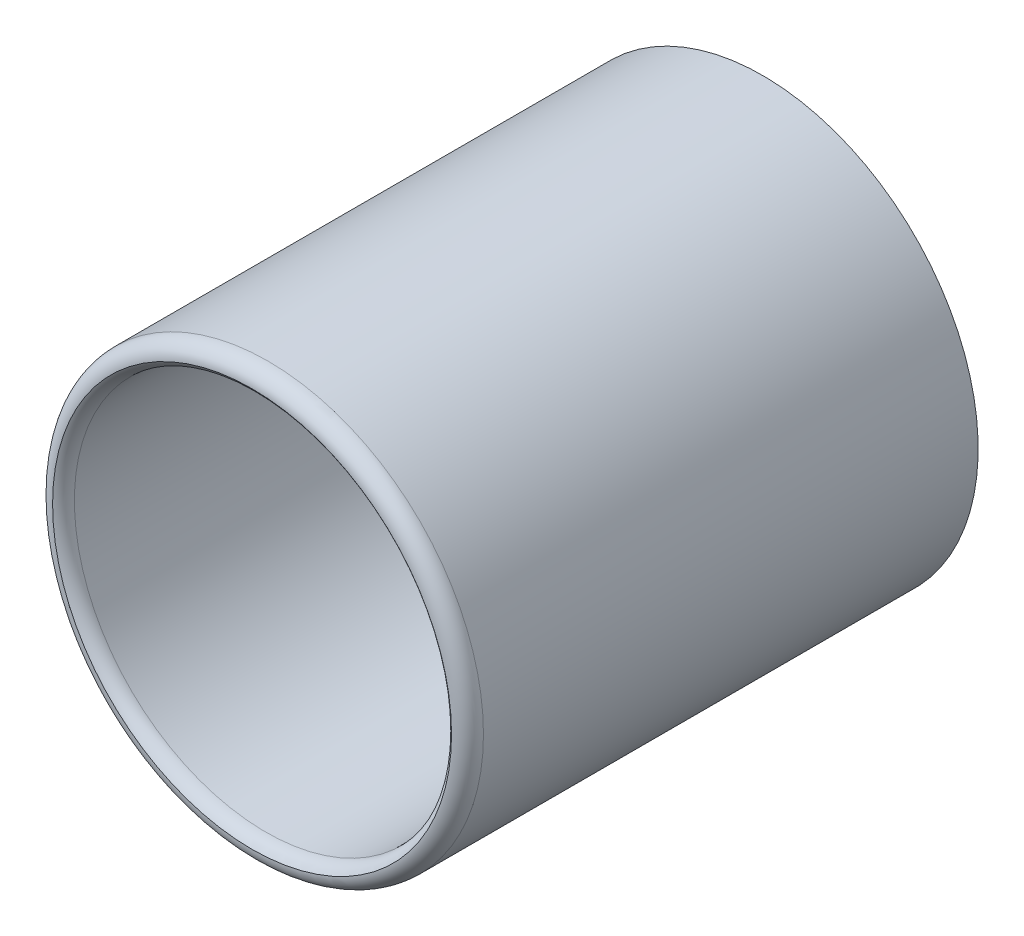
ISO-10303-21;
HEADER;
FILE_DESCRIPTION(('STEP AP214'),'2;1');
FILE_NAME('part.step','',(''),(''),'','','');
FILE_SCHEMA(('AUTOMOTIVE_DESIGN { 1 0 10303 214 1 1 1 1 }'));
ENDSEC;
DATA;
#1=APPLICATION_CONTEXT('core data for automotive mechanical design processes');
#2=APPLICATION_PROTOCOL_DEFINITION('international standard','automotive_design',2000,#1);
#3=PRODUCT_CONTEXT('',#1,'mechanical');
#4=PRODUCT('Part','Part','',(#3));
#5=PRODUCT_RELATED_PRODUCT_CATEGORY('part','',(#4));
#6=PRODUCT_DEFINITION_FORMATION('','',#4);
#7=PRODUCT_DEFINITION_CONTEXT('part definition',#1,'design');
#8=PRODUCT_DEFINITION('design','',#6,#7);
#9=PRODUCT_DEFINITION_SHAPE('','',#8);
#10=(LENGTH_UNIT() NAMED_UNIT(*) SI_UNIT(.MILLI.,.METRE.));
#11=(NAMED_UNIT(*) PLANE_ANGLE_UNIT() SI_UNIT($,.RADIAN.));
#12=(NAMED_UNIT(*) SI_UNIT($,.STERADIAN.) SOLID_ANGLE_UNIT());
#13=UNCERTAINTY_MEASURE_WITH_UNIT(LENGTH_MEASURE(1.E-05),#10,'distance_accuracy_value','');
#14=(GEOMETRIC_REPRESENTATION_CONTEXT(3) GLOBAL_UNCERTAINTY_ASSIGNED_CONTEXT((#13)) GLOBAL_UNIT_ASSIGNED_CONTEXT((#10,
#11,#12)) REPRESENTATION_CONTEXT('',''));
#15=CARTESIAN_POINT('',(0.,0.,0.));
#16=DIRECTION('',(0.,0.,1.));
#17=DIRECTION('',(1.,0.,0.));
#18=AXIS2_PLACEMENT_3D('',#15,#16,#17);
#19=CARTESIAN_POINT('',(0.,0.,150.));
#20=DIRECTION('',(0.,0.,-1.));
#21=DIRECTION('',(-1.,0.,0.));
#22=AXIS2_PLACEMENT_3D('',#19,#20,#21);
#23=CYLINDRICAL_SURFACE('',#22,67.5);
#24=CARTESIAN_POINT('',(0.,0.,145.));
#25=DIRECTION('',(0.,0.,1.));
#26=DIRECTION('',(1.,0.,0.));
#27=AXIS2_PLACEMENT_3D('',#24,#25,#26);
#28=CIRCLE('',#27,67.5);
#29=CARTESIAN_POINT('',(67.5,0.,145.));
#30=VERTEX_POINT('',#29);
#31=EDGE_CURVE('E38',#30,#30,#28,.F.);
#32=ORIENTED_EDGE('',*,*,#31,.T.);
#33=EDGE_LOOP('',(#32));
#34=FACE_BOUND('',#33,.T.);
#35=CARTESIAN_POINT('',(0.,0.,-10.));
#36=DIRECTION('',(0.,0.,-1.));
#37=DIRECTION('',(-1.,0.,0.));
#38=AXIS2_PLACEMENT_3D('',#35,#36,#37);
#39=CIRCLE('',#38,67.5);
#40=CARTESIAN_POINT('',(-67.5,0.,-10.));
#41=VERTEX_POINT('',#40);
#42=EDGE_CURVE('E51',#41,#41,#39,.T.);
#43=ORIENTED_EDGE('',*,*,#42,.F.);
#44=EDGE_LOOP('',(#43));
#45=FACE_BOUND('',#44,.T.);
#46=ADVANCED_FACE('F31',(#34,#45),#23,.T.);
#47=CARTESIAN_POINT('',(0.,0.,150.));
#48=DIRECTION('',(0.,0.,-1.));
#49=DIRECTION('',(-1.,0.,0.));
#50=AXIS2_PLACEMENT_3D('',#47,#48,#49);
#51=CYLINDRICAL_SURFACE('',#50,60.);
#52=CARTESIAN_POINT('',(0.,0.,145.669872981078));
#53=DIRECTION('',(0.,0.,1.));
#54=DIRECTION('',(1.,0.,0.));
#55=AXIS2_PLACEMENT_3D('',#52,#53,#54);
#56=CIRCLE('',#55,60.);
#57=CARTESIAN_POINT('',(60.,0.,145.669872981078));
#58=VERTEX_POINT('',#57);
#59=EDGE_CURVE('E10',#58,#58,#56,.T.);
#60=ORIENTED_EDGE('',*,*,#59,.T.);
#61=EDGE_LOOP('',(#60));
#62=FACE_BOUND('',#61,.T.);
#63=CARTESIAN_POINT('',(0.,0.,0.));
#64=DIRECTION('',(0.,0.,1.));
#65=DIRECTION('',(1.,0.,0.));
#66=AXIS2_PLACEMENT_3D('',#63,#64,#65);
#67=CIRCLE('',#66,60.);
#68=CARTESIAN_POINT('',(60.,0.,0.));
#69=VERTEX_POINT('',#68);
#70=EDGE_CURVE('E46',#69,#69,#67,.T.);
#71=ORIENTED_EDGE('',*,*,#70,.F.);
#72=EDGE_LOOP('',(#71));
#73=FACE_BOUND('',#72,.T.);
#74=ADVANCED_FACE('F58',(#62,#73),#51,.F.);
#75=CARTESIAN_POINT('',(0.,0.,0.));
#76=DIRECTION('',(0.,0.,-1.));
#77=DIRECTION('',(-1.,0.,0.));
#78=AXIS2_PLACEMENT_3D('',#75,#76,#77);
#79=PLANE('',#78);
#80=ORIENTED_EDGE('',*,*,#70,.T.);
#81=EDGE_LOOP('',(#80));
#82=FACE_BOUND('',#81,.T.);
#83=ADVANCED_FACE('F63',(#82),#79,.F.);
#84=CARTESIAN_POINT('',(0.,0.,-10.));
#85=DIRECTION('',(0.,0.,-1.));
#86=DIRECTION('',(-1.,0.,0.));
#87=AXIS2_PLACEMENT_3D('',#84,#85,#86);
#88=PLANE('',#87);
#89=ORIENTED_EDGE('',*,*,#42,.T.);
#90=EDGE_LOOP('',(#89));
#91=FACE_BOUND('',#90,.T.);
#92=ADVANCED_FACE('F55',(#91),#88,.T.);
#93=CARTESIAN_POINT('',(0.,0.,145.));
#94=DIRECTION('',(0.,0.,1.));
#95=DIRECTION('',(1.,0.,0.));
#96=AXIS2_PLACEMENT_3D('',#93,#94,#95);
#97=TOROIDAL_SURFACE('',#96,62.5,5.);
#98=ORIENTED_EDGE('',*,*,#31,.F.);
#99=EDGE_LOOP('',(#98));
#100=FACE_BOUND('',#99,.T.);
#101=CARTESIAN_POINT('',(0.,0.,150.));
#102=DIRECTION('',(0.,0.,1.));
#103=DIRECTION('',(1.,0.,0.));
#104=AXIS2_PLACEMENT_3D('',#101,#102,#103);
#105=CIRCLE('',#104,62.5);
#106=CARTESIAN_POINT('',(62.5,0.,150.));
#107=VERTEX_POINT('',#106);
#108=EDGE_CURVE('E42',#107,#107,#105,.T.);
#109=ORIENTED_EDGE('',*,*,#108,.F.);
#110=EDGE_LOOP('',(#109));
#111=FACE_BOUND('',#110,.T.);
#112=ADVANCED_FACE('F66',(#100,#111),#97,.T.);
#113=CARTESIAN_POINT('',(0.,0.,145.669872981078));
#114=DIRECTION('',(0.,0.,1.));
#115=DIRECTION('',(1.,0.,0.));
#116=AXIS2_PLACEMENT_3D('',#113,#114,#115);
#117=TOROIDAL_SURFACE('',#116,65.,5.);
#118=ORIENTED_EDGE('',*,*,#108,.T.);
#119=EDGE_LOOP('',(#118));
#120=FACE_BOUND('',#119,.T.);
#121=ORIENTED_EDGE('',*,*,#59,.F.);
#122=EDGE_LOOP('',(#121));
#123=FACE_BOUND('',#122,.T.);
#124=ADVANCED_FACE('F33',(#120,#123),#117,.T.);
#125=CLOSED_SHELL('',(#46,#74,#83,#92,#112,#124));
#126=MANIFOLD_SOLID_BREP('B2',#125);
#127=ADVANCED_BREP_SHAPE_REPRESENTATION('',(#18,#126),#14);
#128=SHAPE_DEFINITION_REPRESENTATION(#9,#127);
ENDSEC;
END-ISO-10303-21;
